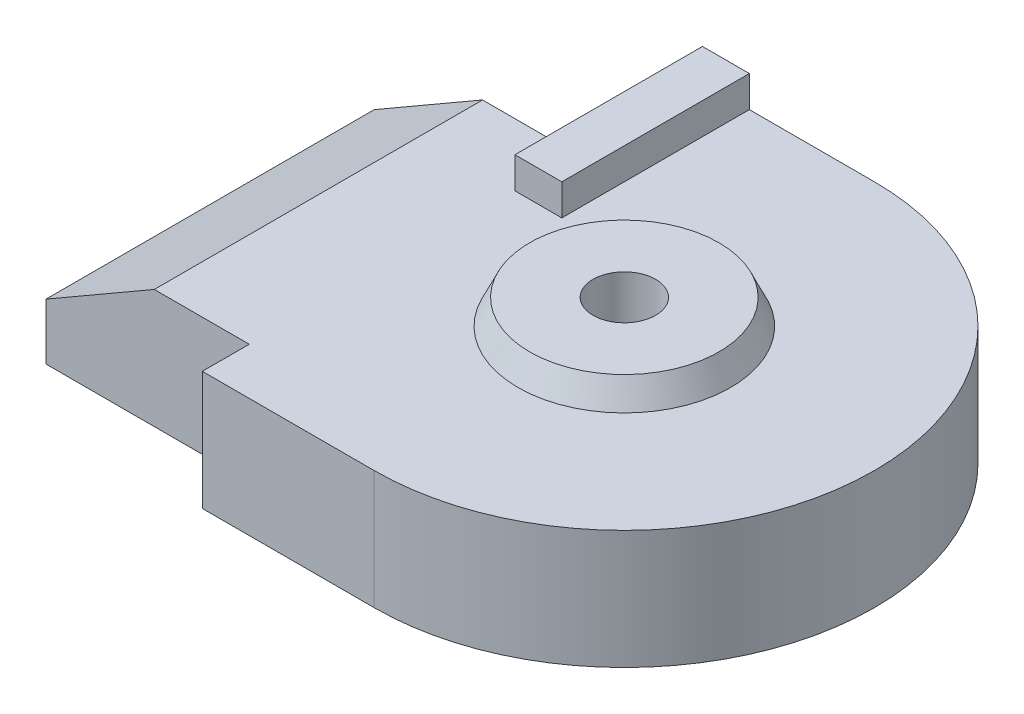
ISO-10303-21;
HEADER;
FILE_DESCRIPTION(('STEP AP214'),'2;1');
FILE_NAME('part.step','',(''),(''),'','','');
FILE_SCHEMA(('AUTOMOTIVE_DESIGN { 1 0 10303 214 1 1 1 1 }'));
ENDSEC;
DATA;
#1=APPLICATION_CONTEXT('core data for automotive mechanical design processes');
#2=APPLICATION_PROTOCOL_DEFINITION('international standard','automotive_design',2000,#1);
#3=PRODUCT_CONTEXT('',#1,'mechanical');
#4=PRODUCT('Part','Part','',(#3));
#5=PRODUCT_RELATED_PRODUCT_CATEGORY('part','',(#4));
#6=PRODUCT_DEFINITION_FORMATION('','',#4);
#7=PRODUCT_DEFINITION_CONTEXT('part definition',#1,'design');
#8=PRODUCT_DEFINITION('design','',#6,#7);
#9=PRODUCT_DEFINITION_SHAPE('','',#8);
#10=(LENGTH_UNIT() NAMED_UNIT(*) SI_UNIT(.MILLI.,.METRE.));
#11=(NAMED_UNIT(*) PLANE_ANGLE_UNIT() SI_UNIT($,.RADIAN.));
#12=(NAMED_UNIT(*) SI_UNIT($,.STERADIAN.) SOLID_ANGLE_UNIT());
#13=UNCERTAINTY_MEASURE_WITH_UNIT(LENGTH_MEASURE(1.E-05),#10,'distance_accuracy_value','');
#14=(GEOMETRIC_REPRESENTATION_CONTEXT(3) GLOBAL_UNCERTAINTY_ASSIGNED_CONTEXT((#13)) GLOBAL_UNIT_ASSIGNED_CONTEXT((#10,
#11,#12)) REPRESENTATION_CONTEXT('',''));
#15=CARTESIAN_POINT('',(0.,0.,0.));
#16=DIRECTION('',(0.,0.,1.));
#17=DIRECTION('',(1.,0.,0.));
#18=AXIS2_PLACEMENT_3D('',#15,#16,#17);
#19=CARTESIAN_POINT('',(0.,190.,0.));
#20=DIRECTION('',(0.,1.,0.));
#21=DIRECTION('',(0.,0.,1.));
#22=AXIS2_PLACEMENT_3D('',#19,#20,#21);
#23=PLANE('',#22);
#24=CARTESIAN_POINT('',(0.,190.,0.));
#25=DIRECTION('',(0.,1.,0.));
#26=DIRECTION('',(0.,0.,1.));
#27=AXIS2_PLACEMENT_3D('',#24,#25,#26);
#28=CIRCLE('',#27,170.);
#29=CARTESIAN_POINT('',(0.,190.,170.));
#30=VERTEX_POINT('',#29);
#31=EDGE_CURVE('E126',#30,#30,#28,.T.);
#32=ORIENTED_EDGE('',*,*,#31,.F.);
#33=EDGE_LOOP('',(#32));
#34=FACE_BOUND('',#33,.T.);
#35=DIRECTION('',(1.,0.,0.));
#36=VECTOR('',#35,1.);
#37=CARTESIAN_POINT('',(-275.,190.,-100.));
#38=LINE('',#37,#36);
#39=CARTESIAN_POINT('',(-275.,190.,-100.));
#40=VERTEX_POINT('',#39);
#41=CARTESIAN_POINT('',(-200.,190.,-100.));
#42=VERTEX_POINT('',#41);
#43=EDGE_CURVE('E31',#40,#42,#38,.T.);
#44=ORIENTED_EDGE('',*,*,#43,.F.);
#45=DIRECTION('',(0.,0.,1.));
#46=VECTOR('',#45,1.);
#47=CARTESIAN_POINT('',(-275.,190.,-400.));
#48=LINE('',#47,#46);
#49=CARTESIAN_POINT('',(-275.,190.,-200.));
#50=VERTEX_POINT('',#49);
#51=EDGE_CURVE('E125',#50,#40,#48,.T.);
#52=ORIENTED_EDGE('',*,*,#51,.F.);
#53=DIRECTION('',(-1.,0.,0.));
#54=VECTOR('',#53,1.);
#55=CARTESIAN_POINT('',(-275.,190.,-200.));
#56=LINE('',#55,#54);
#57=CARTESIAN_POINT('',(-426.794919243112,190.,-200.));
#58=VERTEX_POINT('',#57);
#59=EDGE_CURVE('E146',#50,#58,#56,.T.);
#60=ORIENTED_EDGE('',*,*,#59,.T.);
#61=DIRECTION('',(0.,0.,1.));
#62=VECTOR('',#61,1.);
#63=CARTESIAN_POINT('',(-426.794919243112,190.,325.));
#64=LINE('',#63,#62);
#65=CARTESIAN_POINT('',(-426.794919243112,190.,325.));
#66=VERTEX_POINT('',#65);
#67=EDGE_CURVE('E191',#58,#66,#64,.T.);
#68=ORIENTED_EDGE('',*,*,#67,.T.);
#69=DIRECTION('',(1.,0.,0.));
#70=VECTOR('',#69,1.);
#71=CARTESIAN_POINT('',(-600.,190.,325.));
#72=LINE('',#71,#70);
#73=CARTESIAN_POINT('',(-275.,190.,325.));
#74=VERTEX_POINT('',#73);
#75=EDGE_CURVE('E149',#66,#74,#72,.T.);
#76=ORIENTED_EDGE('',*,*,#75,.T.);
#77=DIRECTION('',(0.,0.,1.));
#78=VECTOR('',#77,1.);
#79=CARTESIAN_POINT('',(-275.,190.,325.));
#80=LINE('',#79,#78);
#81=CARTESIAN_POINT('',(-275.,190.,400.));
#82=VERTEX_POINT('',#81);
#83=EDGE_CURVE('E151',#74,#82,#80,.T.);
#84=ORIENTED_EDGE('',*,*,#83,.T.);
#85=DIRECTION('',(1.,0.,0.));
#86=VECTOR('',#85,1.);
#87=CARTESIAN_POINT('',(-275.,190.,400.));
#88=LINE('',#87,#86);
#89=CARTESIAN_POINT('',(0.,190.,400.));
#90=VERTEX_POINT('',#89);
#91=EDGE_CURVE('E138',#82,#90,#88,.T.);
#92=ORIENTED_EDGE('',*,*,#91,.T.);
#93=CARTESIAN_POINT('',(0.,190.,0.));
#94=DIRECTION('',(0.,1.,0.));
#95=DIRECTION('',(0.,0.,1.));
#96=AXIS2_PLACEMENT_3D('',#93,#94,#95);
#97=CIRCLE('',#96,400.);
#98=CARTESIAN_POINT('',(0.,190.,-400.));
#99=VERTEX_POINT('',#98);
#100=EDGE_CURVE('E141',#90,#99,#97,.T.);
#101=ORIENTED_EDGE('',*,*,#100,.T.);
#102=DIRECTION('',(-1.,0.,0.));
#103=VECTOR('',#102,1.);
#104=CARTESIAN_POINT('',(0.,190.,-400.));
#105=LINE('',#104,#103);
#106=CARTESIAN_POINT('',(-200.,190.,-400.));
#107=VERTEX_POINT('',#106);
#108=EDGE_CURVE('E144',#99,#107,#105,.T.);
#109=ORIENTED_EDGE('',*,*,#108,.T.);
#110=DIRECTION('',(0.,0.,-1.));
#111=VECTOR('',#110,1.);
#112=CARTESIAN_POINT('',(-200.,190.,-400.));
#113=LINE('',#112,#111);
#114=EDGE_CURVE('E36',#42,#107,#113,.T.);
#115=ORIENTED_EDGE('',*,*,#114,.F.);
#116=EDGE_LOOP('',(#44,#52,#60,#68,#76,#84,#92,#101,#109,#115));
#117=FACE_BOUND('',#116,.T.);
#118=ADVANCED_FACE('F16',(#34,#117),#23,.T.);
#119=CARTESIAN_POINT('',(-275.,190.,400.));
#120=DIRECTION('',(0.,0.,-1.));
#121=DIRECTION('',(-1.,0.,0.));
#122=AXIS2_PLACEMENT_3D('',#119,#120,#121);
#123=PLANE('',#122);
#124=DIRECTION('',(1.,0.,0.));
#125=VECTOR('',#124,1.);
#126=CARTESIAN_POINT('',(-275.,0.,400.));
#127=LINE('',#126,#125);
#128=CARTESIAN_POINT('',(-275.,0.,400.));
#129=VERTEX_POINT('',#128);
#130=CARTESIAN_POINT('',(0.,0.,400.));
#131=VERTEX_POINT('',#130);
#132=EDGE_CURVE('E137',#129,#131,#127,.T.);
#133=ORIENTED_EDGE('',*,*,#132,.T.);
#134=DIRECTION('',(0.,-1.,0.));
#135=VECTOR('',#134,1.);
#136=CARTESIAN_POINT('',(0.,190.,400.));
#137=LINE('',#136,#135);
#138=EDGE_CURVE('E188',#90,#131,#137,.T.);
#139=ORIENTED_EDGE('',*,*,#138,.F.);
#140=ORIENTED_EDGE('',*,*,#91,.F.);
#141=DIRECTION('',(0.,-1.,0.));
#142=VECTOR('',#141,1.);
#143=CARTESIAN_POINT('',(-275.,190.,400.));
#144=LINE('',#143,#142);
#145=EDGE_CURVE('E153',#82,#129,#144,.T.);
#146=ORIENTED_EDGE('',*,*,#145,.T.);
#147=EDGE_LOOP('',(#133,#139,#140,#146));
#148=FACE_BOUND('',#147,.T.);
#149=ADVANCED_FACE('F221',(#148),#123,.F.);
#150=CARTESIAN_POINT('',(0.,190.,0.));
#151=DIRECTION('',(0.,-1.,0.));
#152=DIRECTION('',(0.,0.,-1.));
#153=AXIS2_PLACEMENT_3D('',#150,#151,#152);
#154=CYLINDRICAL_SURFACE('',#153,400.);
#155=CARTESIAN_POINT('',(0.,0.,0.));
#156=DIRECTION('',(0.,1.,0.));
#157=DIRECTION('',(0.,0.,1.));
#158=AXIS2_PLACEMENT_3D('',#155,#156,#157);
#159=CIRCLE('',#158,400.);
#160=CARTESIAN_POINT('',(0.,0.,-400.));
#161=VERTEX_POINT('',#160);
#162=EDGE_CURVE('E156',#131,#161,#159,.T.);
#163=ORIENTED_EDGE('',*,*,#162,.T.);
#164=DIRECTION('',(0.,-1.,0.));
#165=VECTOR('',#164,1.);
#166=CARTESIAN_POINT('',(0.,190.,-400.));
#167=LINE('',#166,#165);
#168=EDGE_CURVE('E185',#99,#161,#167,.T.);
#169=ORIENTED_EDGE('',*,*,#168,.F.);
#170=ORIENTED_EDGE('',*,*,#100,.F.);
#171=ORIENTED_EDGE('',*,*,#138,.T.);
#172=EDGE_LOOP('',(#163,#169,#170,#171));
#173=FACE_BOUND('',#172,.T.);
#174=ADVANCED_FACE('F224',(#173),#154,.T.);
#175=CARTESIAN_POINT('',(0.,190.,-400.));
#176=DIRECTION('',(0.,0.,1.));
#177=DIRECTION('',(1.,0.,0.));
#178=AXIS2_PLACEMENT_3D('',#175,#176,#177);
#179=PLANE('',#178);
#180=DIRECTION('',(-1.,0.,0.));
#181=VECTOR('',#180,1.);
#182=CARTESIAN_POINT('',(0.,0.,-400.));
#183=LINE('',#182,#181);
#184=CARTESIAN_POINT('',(-275.,0.,-400.));
#185=VERTEX_POINT('',#184);
#186=EDGE_CURVE('E158',#161,#185,#183,.T.);
#187=ORIENTED_EDGE('',*,*,#186,.T.);
#188=DIRECTION('',(0.,-1.,0.));
#189=VECTOR('',#188,1.);
#190=CARTESIAN_POINT('',(-275.,190.,-400.));
#191=LINE('',#190,#189);
#192=CARTESIAN_POINT('',(-275.,240.,-400.));
#193=VERTEX_POINT('',#192);
#194=EDGE_CURVE('E183',#193,#185,#191,.T.);
#195=ORIENTED_EDGE('',*,*,#194,.F.);
#196=DIRECTION('',(-1.,0.,0.));
#197=VECTOR('',#196,1.);
#198=CARTESIAN_POINT('',(-275.,240.,-400.));
#199=LINE('',#198,#197);
#200=CARTESIAN_POINT('',(-200.,240.,-400.));
#201=VERTEX_POINT('',#200);
#202=EDGE_CURVE('E119',#201,#193,#199,.T.);
#203=ORIENTED_EDGE('',*,*,#202,.F.);
#204=DIRECTION('',(0.,-1.,0.));
#205=VECTOR('',#204,1.);
#206=CARTESIAN_POINT('',(-200.,240.,-400.));
#207=LINE('',#206,#205);
#208=EDGE_CURVE('E131',#201,#107,#207,.T.);
#209=ORIENTED_EDGE('',*,*,#208,.T.);
#210=ORIENTED_EDGE('',*,*,#108,.F.);
#211=ORIENTED_EDGE('',*,*,#168,.T.);
#212=EDGE_LOOP('',(#187,#195,#203,#209,#210,#211));
#213=FACE_BOUND('',#212,.T.);
#214=ADVANCED_FACE('F229',(#213),#179,.F.);
#215=CARTESIAN_POINT('',(-275.,190.,-400.));
#216=DIRECTION('',(1.,0.,0.));
#217=DIRECTION('',(0.,0.,-1.));
#218=AXIS2_PLACEMENT_3D('',#215,#216,#217);
#219=PLANE('',#218);
#220=DIRECTION('',(0.,0.,1.));
#221=VECTOR('',#220,1.);
#222=CARTESIAN_POINT('',(-275.,0.,-400.));
#223=LINE('',#222,#221);
#224=CARTESIAN_POINT('',(-275.,0.,-200.));
#225=VERTEX_POINT('',#224);
#226=EDGE_CURVE('E160',#185,#225,#223,.T.);
#227=ORIENTED_EDGE('',*,*,#226,.T.);
#228=DIRECTION('',(0.,-1.,0.));
#229=VECTOR('',#228,1.);
#230=CARTESIAN_POINT('',(-275.,190.,-200.));
#231=LINE('',#230,#229);
#232=EDGE_CURVE('E180',#50,#225,#231,.T.);
#233=ORIENTED_EDGE('',*,*,#232,.F.);
#234=ORIENTED_EDGE('',*,*,#51,.T.);
#235=DIRECTION('',(0.,-1.,0.));
#236=VECTOR('',#235,1.);
#237=CARTESIAN_POINT('',(-275.,240.,-100.));
#238=LINE('',#237,#236);
#239=CARTESIAN_POINT('',(-275.,240.,-100.));
#240=VERTEX_POINT('',#239);
#241=EDGE_CURVE('E107',#240,#40,#238,.T.);
#242=ORIENTED_EDGE('',*,*,#241,.F.);
#243=DIRECTION('',(0.,0.,1.));
#244=VECTOR('',#243,1.);
#245=CARTESIAN_POINT('',(-275.,240.,-400.));
#246=LINE('',#245,#244);
#247=EDGE_CURVE('E113',#193,#240,#246,.T.);
#248=ORIENTED_EDGE('',*,*,#247,.F.);
#249=ORIENTED_EDGE('',*,*,#194,.T.);
#250=EDGE_LOOP('',(#227,#233,#234,#242,#248,#249));
#251=FACE_BOUND('',#250,.T.);
#252=ADVANCED_FACE('F123',(#251),#219,.F.);
#253=CARTESIAN_POINT('',(-275.,190.,-200.));
#254=DIRECTION('',(0.,0.,1.));
#255=DIRECTION('',(1.,0.,0.));
#256=AXIS2_PLACEMENT_3D('',#253,#254,#255);
#257=PLANE('',#256);
#258=DIRECTION('',(0.,-1.,0.));
#259=VECTOR('',#258,1.);
#260=CARTESIAN_POINT('',(-600.,190.,-200.));
#261=LINE('',#260,#259);
#262=CARTESIAN_POINT('',(-600.,90.,-200.));
#263=VERTEX_POINT('',#262);
#264=CARTESIAN_POINT('',(-600.,0.,-200.));
#265=VERTEX_POINT('',#264);
#266=EDGE_CURVE('E178',#263,#265,#261,.T.);
#267=ORIENTED_EDGE('',*,*,#266,.F.);
#268=DIRECTION('',(0.866025403784438,0.5,0.));
#269=VECTOR('',#268,1.);
#270=CARTESIAN_POINT('',(-426.794919243112,190.,-200.));
#271=LINE('',#270,#269);
#272=EDGE_CURVE('E10',#263,#58,#271,.T.);
#273=ORIENTED_EDGE('',*,*,#272,.T.);
#274=ORIENTED_EDGE('',*,*,#59,.F.);
#275=ORIENTED_EDGE('',*,*,#232,.T.);
#276=DIRECTION('',(-1.,0.,0.));
#277=VECTOR('',#276,1.);
#278=CARTESIAN_POINT('',(-275.,0.,-200.));
#279=LINE('',#278,#277);
#280=EDGE_CURVE('E162',#225,#265,#279,.T.);
#281=ORIENTED_EDGE('',*,*,#280,.T.);
#282=EDGE_LOOP('',(#267,#273,#274,#275,#281));
#283=FACE_BOUND('',#282,.T.);
#284=ADVANCED_FACE('F203',(#283),#257,.F.);
#285=CARTESIAN_POINT('',(-600.,190.,-200.));
#286=DIRECTION('',(1.,0.,0.));
#287=DIRECTION('',(0.,0.,-1.));
#288=AXIS2_PLACEMENT_3D('',#285,#286,#287);
#289=PLANE('',#288);
#290=DIRECTION('',(0.,-1.,0.));
#291=VECTOR('',#290,1.);
#292=CARTESIAN_POINT('',(-600.,190.,325.));
#293=LINE('',#292,#291);
#294=CARTESIAN_POINT('',(-600.,90.,325.));
#295=VERTEX_POINT('',#294);
#296=CARTESIAN_POINT('',(-600.,0.,325.));
#297=VERTEX_POINT('',#296);
#298=EDGE_CURVE('E176',#295,#297,#293,.T.);
#299=ORIENTED_EDGE('',*,*,#298,.F.);
#300=DIRECTION('',(0.,0.,-1.));
#301=VECTOR('',#300,1.);
#302=CARTESIAN_POINT('',(-600.,90.,-200.));
#303=LINE('',#302,#301);
#304=EDGE_CURVE('E24',#295,#263,#303,.T.);
#305=ORIENTED_EDGE('',*,*,#304,.T.);
#306=ORIENTED_EDGE('',*,*,#266,.T.);
#307=DIRECTION('',(0.,0.,1.));
#308=VECTOR('',#307,1.);
#309=CARTESIAN_POINT('',(-600.,0.,-200.));
#310=LINE('',#309,#308);
#311=EDGE_CURVE('E165',#265,#297,#310,.T.);
#312=ORIENTED_EDGE('',*,*,#311,.T.);
#313=EDGE_LOOP('',(#299,#305,#306,#312));
#314=FACE_BOUND('',#313,.T.);
#315=ADVANCED_FACE('F199',(#314),#289,.F.);
#316=CARTESIAN_POINT('',(-600.,190.,325.));
#317=DIRECTION('',(0.,0.,-1.));
#318=DIRECTION('',(-1.,0.,0.));
#319=AXIS2_PLACEMENT_3D('',#316,#317,#318);
#320=PLANE('',#319);
#321=ORIENTED_EDGE('',*,*,#75,.F.);
#322=DIRECTION('',(-0.866025403784438,-0.5,0.));
#323=VECTOR('',#322,1.);
#324=CARTESIAN_POINT('',(-426.794919243112,190.,325.));
#325=LINE('',#324,#323);
#326=EDGE_CURVE('E194',#66,#295,#325,.T.);
#327=ORIENTED_EDGE('',*,*,#326,.T.);
#328=ORIENTED_EDGE('',*,*,#298,.T.);
#329=DIRECTION('',(1.,0.,0.));
#330=VECTOR('',#329,1.);
#331=CARTESIAN_POINT('',(-600.,0.,325.));
#332=LINE('',#331,#330);
#333=CARTESIAN_POINT('',(-275.,0.,325.));
#334=VERTEX_POINT('',#333);
#335=EDGE_CURVE('E168',#297,#334,#332,.T.);
#336=ORIENTED_EDGE('',*,*,#335,.T.);
#337=DIRECTION('',(0.,-1.,0.));
#338=VECTOR('',#337,1.);
#339=CARTESIAN_POINT('',(-275.,190.,325.));
#340=LINE('',#339,#338);
#341=EDGE_CURVE('E173',#74,#334,#340,.T.);
#342=ORIENTED_EDGE('',*,*,#341,.F.);
#343=EDGE_LOOP('',(#321,#327,#328,#336,#342));
#344=FACE_BOUND('',#343,.T.);
#345=ADVANCED_FACE('F210',(#344),#320,.F.);
#346=CARTESIAN_POINT('',(-275.,190.,325.));
#347=DIRECTION('',(1.,0.,0.));
#348=DIRECTION('',(0.,0.,-1.));
#349=AXIS2_PLACEMENT_3D('',#346,#347,#348);
#350=PLANE('',#349);
#351=DIRECTION('',(0.,0.,1.));
#352=VECTOR('',#351,1.);
#353=CARTESIAN_POINT('',(-275.,0.,325.));
#354=LINE('',#353,#352);
#355=EDGE_CURVE('E142',#334,#129,#354,.T.);
#356=ORIENTED_EDGE('',*,*,#355,.T.);
#357=ORIENTED_EDGE('',*,*,#145,.F.);
#358=ORIENTED_EDGE('',*,*,#83,.F.);
#359=ORIENTED_EDGE('',*,*,#341,.T.);
#360=EDGE_LOOP('',(#356,#357,#358,#359));
#361=FACE_BOUND('',#360,.T.);
#362=ADVANCED_FACE('F216',(#361),#350,.F.);
#363=CARTESIAN_POINT('',(0.,0.,0.));
#364=DIRECTION('',(0.,1.,0.));
#365=DIRECTION('',(0.,0.,1.));
#366=AXIS2_PLACEMENT_3D('',#363,#364,#365);
#367=PLANE('',#366);
#368=CARTESIAN_POINT('',(0.,0.,0.));
#369=DIRECTION('',(0.,1.,0.));
#370=DIRECTION('',(0.,0.,1.));
#371=AXIS2_PLACEMENT_3D('',#368,#369,#370);
#372=CIRCLE('',#371,50.);
#373=CARTESIAN_POINT('',(0.,0.,50.));
#374=VERTEX_POINT('',#373);
#375=EDGE_CURVE('E238',#374,#374,#372,.T.);
#376=ORIENTED_EDGE('',*,*,#375,.T.);
#377=EDGE_LOOP('',(#376));
#378=FACE_BOUND('',#377,.T.);
#379=ORIENTED_EDGE('',*,*,#132,.F.);
#380=ORIENTED_EDGE('',*,*,#355,.F.);
#381=ORIENTED_EDGE('',*,*,#335,.F.);
#382=ORIENTED_EDGE('',*,*,#311,.F.);
#383=ORIENTED_EDGE('',*,*,#280,.F.);
#384=ORIENTED_EDGE('',*,*,#226,.F.);
#385=ORIENTED_EDGE('',*,*,#186,.F.);
#386=ORIENTED_EDGE('',*,*,#162,.F.);
#387=EDGE_LOOP('',(#379,#380,#381,#382,#383,#384,#385,#386));
#388=FACE_BOUND('',#387,.T.);
#389=ADVANCED_FACE('F269',(#378,#388),#367,.F.);
#390=CARTESIAN_POINT('',(-426.794919243112,190.,0.));
#391=DIRECTION('',(-0.5,0.866025403784438,0.));
#392=DIRECTION('',(-0.866025403784438,-0.5,0.));
#393=AXIS2_PLACEMENT_3D('',#390,#391,#392);
#394=PLANE('',#393);
#395=ORIENTED_EDGE('',*,*,#272,.F.);
#396=ORIENTED_EDGE('',*,*,#304,.F.);
#397=ORIENTED_EDGE('',*,*,#326,.F.);
#398=ORIENTED_EDGE('',*,*,#67,.F.);
#399=EDGE_LOOP('',(#395,#396,#397,#398));
#400=FACE_BOUND('',#399,.T.);
#401=ADVANCED_FACE('F18',(#400),#394,.T.);
#402=CARTESIAN_POINT('',(0.,190.,0.));
#403=DIRECTION('',(0.,-1.,0.));
#404=DIRECTION('',(0.,0.,1.));
#405=AXIS2_PLACEMENT_3D('',#402,#403,#404);
#406=CONICAL_SURFACE('',#405,170.,0.436332312998583);
#407=CARTESIAN_POINT('',(0.,230.,0.));
#408=DIRECTION('',(0.,1.,0.));
#409=DIRECTION('',(0.,0.,1.));
#410=AXIS2_PLACEMENT_3D('',#407,#408,#409);
#411=CIRCLE('',#410,151.3476936738);
#412=CARTESIAN_POINT('',(0.,230.,151.3476936738));
#413=VERTEX_POINT('',#412);
#414=EDGE_CURVE('E129',#413,#413,#411,.T.);
#415=ORIENTED_EDGE('',*,*,#414,.F.);
#416=EDGE_LOOP('',(#415));
#417=FACE_BOUND('',#416,.T.);
#418=ORIENTED_EDGE('',*,*,#31,.T.);
#419=EDGE_LOOP('',(#418));
#420=FACE_BOUND('',#419,.T.);
#421=ADVANCED_FACE('F253',(#417,#420),#406,.T.);
#422=CARTESIAN_POINT('',(0.,230.,0.));
#423=DIRECTION('',(0.,1.,0.));
#424=DIRECTION('',(0.,0.,1.));
#425=AXIS2_PLACEMENT_3D('',#422,#423,#424);
#426=PLANE('',#425);
#427=CARTESIAN_POINT('',(0.,230.,0.));
#428=DIRECTION('',(0.,1.,0.));
#429=DIRECTION('',(0.,0.,1.));
#430=AXIS2_PLACEMENT_3D('',#427,#428,#429);
#431=CIRCLE('',#430,50.);
#432=CARTESIAN_POINT('',(0.,230.,50.));
#433=VERTEX_POINT('',#432);
#434=EDGE_CURVE('E240',#433,#433,#431,.T.);
#435=ORIENTED_EDGE('',*,*,#434,.F.);
#436=EDGE_LOOP('',(#435));
#437=FACE_BOUND('',#436,.T.);
#438=ORIENTED_EDGE('',*,*,#414,.T.);
#439=EDGE_LOOP('',(#438));
#440=FACE_BOUND('',#439,.T.);
#441=ADVANCED_FACE('F250',(#437,#440),#426,.T.);
#442=CARTESIAN_POINT('',(-275.,240.,-100.));
#443=DIRECTION('',(0.,0.,-1.));
#444=DIRECTION('',(-1.,0.,0.));
#445=AXIS2_PLACEMENT_3D('',#442,#443,#444);
#446=PLANE('',#445);
#447=ORIENTED_EDGE('',*,*,#43,.T.);
#448=DIRECTION('',(0.,-1.,0.));
#449=VECTOR('',#448,1.);
#450=CARTESIAN_POINT('',(-200.,240.,-100.));
#451=LINE('',#450,#449);
#452=CARTESIAN_POINT('',(-200.,240.,-100.));
#453=VERTEX_POINT('',#452);
#454=EDGE_CURVE('E109',#453,#42,#451,.T.);
#455=ORIENTED_EDGE('',*,*,#454,.F.);
#456=DIRECTION('',(1.,0.,0.));
#457=VECTOR('',#456,1.);
#458=CARTESIAN_POINT('',(-275.,240.,-100.));
#459=LINE('',#458,#457);
#460=EDGE_CURVE('E103',#240,#453,#459,.T.);
#461=ORIENTED_EDGE('',*,*,#460,.F.);
#462=ORIENTED_EDGE('',*,*,#241,.T.);
#463=EDGE_LOOP('',(#447,#455,#461,#462));
#464=FACE_BOUND('',#463,.T.);
#465=ADVANCED_FACE('F105',(#464),#446,.F.);
#466=CARTESIAN_POINT('',(-200.,240.,-400.));
#467=DIRECTION('',(-1.,0.,0.));
#468=DIRECTION('',(0.,0.,1.));
#469=AXIS2_PLACEMENT_3D('',#466,#467,#468);
#470=PLANE('',#469);
#471=ORIENTED_EDGE('',*,*,#114,.T.);
#472=ORIENTED_EDGE('',*,*,#208,.F.);
#473=DIRECTION('',(0.,0.,-1.));
#474=VECTOR('',#473,1.);
#475=CARTESIAN_POINT('',(-200.,240.,-400.));
#476=LINE('',#475,#474);
#477=EDGE_CURVE('E112',#453,#201,#476,.T.);
#478=ORIENTED_EDGE('',*,*,#477,.F.);
#479=ORIENTED_EDGE('',*,*,#454,.T.);
#480=EDGE_LOOP('',(#471,#472,#478,#479));
#481=FACE_BOUND('',#480,.T.);
#482=ADVANCED_FACE('F232',(#481),#470,.F.);
#483=CARTESIAN_POINT('',(-275.,240.,-100.));
#484=DIRECTION('',(0.,1.,0.));
#485=DIRECTION('',(0.,0.,1.));
#486=AXIS2_PLACEMENT_3D('',#483,#484,#485);
#487=PLANE('',#486);
#488=ORIENTED_EDGE('',*,*,#247,.T.);
#489=ORIENTED_EDGE('',*,*,#460,.T.);
#490=ORIENTED_EDGE('',*,*,#477,.T.);
#491=ORIENTED_EDGE('',*,*,#202,.T.);
#492=EDGE_LOOP('',(#488,#489,#490,#491));
#493=FACE_BOUND('',#492,.T.);
#494=ADVANCED_FACE('F117',(#493),#487,.T.);
#495=CARTESIAN_POINT('',(0.,0.,0.));
#496=DIRECTION('',(0.,1.,0.));
#497=DIRECTION('',(0.,0.,1.));
#498=AXIS2_PLACEMENT_3D('',#495,#496,#497);
#499=CYLINDRICAL_SURFACE('',#498,50.);
#500=ORIENTED_EDGE('',*,*,#375,.F.);
#501=EDGE_LOOP('',(#500));
#502=FACE_BOUND('',#501,.T.);
#503=ORIENTED_EDGE('',*,*,#434,.T.);
#504=EDGE_LOOP('',(#503));
#505=FACE_BOUND('',#504,.T.);
#506=ADVANCED_FACE('F248',(#502,#505),#499,.F.);
#507=CLOSED_SHELL('',(#118,#149,#174,#214,#252,#284,#315,#345,#362,#389,#401,#421,#441,#465,
#482,#494,#506));
#508=MANIFOLD_SOLID_BREP('B1',#507);
#509=ADVANCED_BREP_SHAPE_REPRESENTATION('',(#18,#508),#14);
#510=SHAPE_DEFINITION_REPRESENTATION(#9,#509);
ENDSEC;
END-ISO-10303-21;
